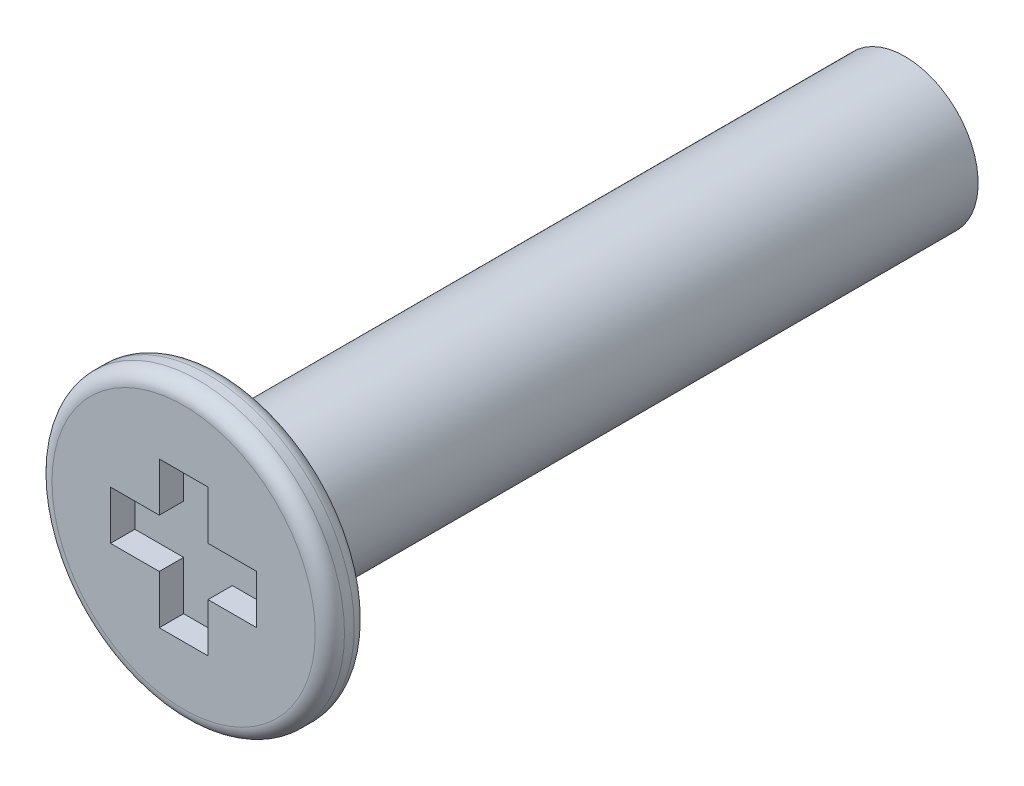
ISO-10303-21;
HEADER;
FILE_DESCRIPTION(('STEP AP214'),'2;1');
FILE_NAME('part.step','',(''),(''),'','','');
FILE_SCHEMA(('AUTOMOTIVE_DESIGN { 1 0 10303 214 1 1 1 1 }'));
ENDSEC;
DATA;
#1=APPLICATION_CONTEXT('core data for automotive mechanical design processes');
#2=APPLICATION_PROTOCOL_DEFINITION('international standard','automotive_design',2000,#1);
#3=PRODUCT_CONTEXT('',#1,'mechanical');
#4=PRODUCT('Part','Part','',(#3));
#5=PRODUCT_RELATED_PRODUCT_CATEGORY('part','',(#4));
#6=PRODUCT_DEFINITION_FORMATION('','',#4);
#7=PRODUCT_DEFINITION_CONTEXT('part definition',#1,'design');
#8=PRODUCT_DEFINITION('design','',#6,#7);
#9=PRODUCT_DEFINITION_SHAPE('','',#8);
#10=(LENGTH_UNIT() NAMED_UNIT(*) SI_UNIT(.MILLI.,.METRE.));
#11=(NAMED_UNIT(*) PLANE_ANGLE_UNIT() SI_UNIT($,.RADIAN.));
#12=(NAMED_UNIT(*) SI_UNIT($,.STERADIAN.) SOLID_ANGLE_UNIT());
#13=UNCERTAINTY_MEASURE_WITH_UNIT(LENGTH_MEASURE(1.E-05),#10,'distance_accuracy_value','');
#14=(GEOMETRIC_REPRESENTATION_CONTEXT(3) GLOBAL_UNCERTAINTY_ASSIGNED_CONTEXT((#13)) GLOBAL_UNIT_ASSIGNED_CONTEXT((#10,
#11,#12)) REPRESENTATION_CONTEXT('',''));
#15=CARTESIAN_POINT('',(0.,0.,0.));
#16=DIRECTION('',(0.,0.,1.));
#17=DIRECTION('',(1.,0.,0.));
#18=AXIS2_PLACEMENT_3D('',#15,#16,#17);
#19=CARTESIAN_POINT('',(0.,0.,0.3));
#20=DIRECTION('',(0.,0.,-1.));
#21=DIRECTION('',(0.,-1.,0.));
#22=AXIS2_PLACEMENT_3D('',#19,#20,#21);
#23=PLANE('',#22);
#24=DIRECTION('',(-1.,0.,0.));
#25=VECTOR('',#24,1.);
#26=CARTESIAN_POINT('',(0.499999988824129,-1.49999996647239,0.3));
#27=LINE('',#26,#25);
#28=CARTESIAN_POINT('',(0.499999988824129,-1.49999996647239,0.3));
#29=VERTEX_POINT('',#28);
#30=CARTESIAN_POINT('',(-0.499999988824129,-1.49999996647239,0.3));
#31=VERTEX_POINT('',#30);
#32=EDGE_CURVE('E11',#29,#31,#27,.T.);
#33=ORIENTED_EDGE('',*,*,#32,.F.);
#34=DIRECTION('',(0.,-1.,0.));
#35=VECTOR('',#34,1.);
#36=CARTESIAN_POINT('',(0.499999988824129,1.49999996647239,0.3));
#37=LINE('',#36,#35);
#38=CARTESIAN_POINT('',(0.499999988824129,-0.499999988824129,0.3));
#39=VERTEX_POINT('',#38);
#40=EDGE_CURVE('E281',#39,#29,#37,.T.);
#41=ORIENTED_EDGE('',*,*,#40,.F.);
#42=DIRECTION('',(-1.,0.,0.));
#43=VECTOR('',#42,1.);
#44=CARTESIAN_POINT('',(1.49999996647239,-0.499999988824129,0.3));
#45=LINE('',#44,#43);
#46=CARTESIAN_POINT('',(1.49999996647239,-0.499999988824129,0.3));
#47=VERTEX_POINT('',#46);
#48=EDGE_CURVE('E227',#47,#39,#45,.T.);
#49=ORIENTED_EDGE('',*,*,#48,.F.);
#50=DIRECTION('',(0.,-1.,0.));
#51=VECTOR('',#50,1.);
#52=CARTESIAN_POINT('',(1.49999996647239,0.499999988824129,0.3));
#53=LINE('',#52,#51);
#54=CARTESIAN_POINT('',(1.49999996647239,0.499999988824129,0.3));
#55=VERTEX_POINT('',#54);
#56=EDGE_CURVE('E292',#55,#47,#53,.T.);
#57=ORIENTED_EDGE('',*,*,#56,.F.);
#58=DIRECTION('',(1.,0.,0.));
#59=VECTOR('',#58,1.);
#60=CARTESIAN_POINT('',(-1.49999996647239,0.499999988824129,0.3));
#61=LINE('',#60,#59);
#62=CARTESIAN_POINT('',(0.499999988824129,0.499999988824129,0.3));
#63=VERTEX_POINT('',#62);
#64=EDGE_CURVE('E291',#63,#55,#61,.T.);
#65=ORIENTED_EDGE('',*,*,#64,.F.);
#66=DIRECTION('',(0.,-1.,0.));
#67=VECTOR('',#66,1.);
#68=CARTESIAN_POINT('',(0.499999988824129,1.49999996647239,0.3));
#69=LINE('',#68,#67);
#70=CARTESIAN_POINT('',(0.499999988824129,1.49999996647239,0.3));
#71=VERTEX_POINT('',#70);
#72=EDGE_CURVE('E187',#71,#63,#69,.T.);
#73=ORIENTED_EDGE('',*,*,#72,.F.);
#74=DIRECTION('',(1.,0.,0.));
#75=VECTOR('',#74,1.);
#76=CARTESIAN_POINT('',(-0.499999988824129,1.49999996647239,0.3));
#77=LINE('',#76,#75);
#78=CARTESIAN_POINT('',(-0.499999988824129,1.49999996647239,0.3));
#79=VERTEX_POINT('',#78);
#80=EDGE_CURVE('E186',#79,#71,#77,.T.);
#81=ORIENTED_EDGE('',*,*,#80,.F.);
#82=DIRECTION('',(0.,1.,0.));
#83=VECTOR('',#82,1.);
#84=CARTESIAN_POINT('',(-0.499999988824129,-1.49999996647239,0.3));
#85=LINE('',#84,#83);
#86=CARTESIAN_POINT('',(-0.499999988824129,0.499999988824129,0.3));
#87=VERTEX_POINT('',#86);
#88=EDGE_CURVE('E191',#87,#79,#85,.T.);
#89=ORIENTED_EDGE('',*,*,#88,.F.);
#90=DIRECTION('',(1.,0.,0.));
#91=VECTOR('',#90,1.);
#92=CARTESIAN_POINT('',(-1.49999996647239,0.499999988824129,0.3));
#93=LINE('',#92,#91);
#94=CARTESIAN_POINT('',(-1.49999996647239,0.499999988824129,0.3));
#95=VERTEX_POINT('',#94);
#96=EDGE_CURVE('E257',#95,#87,#93,.T.);
#97=ORIENTED_EDGE('',*,*,#96,.F.);
#98=DIRECTION('',(0.,1.,0.));
#99=VECTOR('',#98,1.);
#100=CARTESIAN_POINT('',(-1.49999996647239,-0.499999988824129,0.3));
#101=LINE('',#100,#99);
#102=CARTESIAN_POINT('',(-1.49999996647239,-0.499999988824129,0.3));
#103=VERTEX_POINT('',#102);
#104=EDGE_CURVE('E315',#103,#95,#101,.T.);
#105=ORIENTED_EDGE('',*,*,#104,.F.);
#106=DIRECTION('',(-1.,0.,0.));
#107=VECTOR('',#106,1.);
#108=CARTESIAN_POINT('',(1.49999996647239,-0.499999988824129,0.3));
#109=LINE('',#108,#107);
#110=CARTESIAN_POINT('',(-0.499999988824129,-0.499999988824129,0.3));
#111=VERTEX_POINT('',#110);
#112=EDGE_CURVE('E322',#111,#103,#109,.T.);
#113=ORIENTED_EDGE('',*,*,#112,.F.);
#114=DIRECTION('',(0.,1.,0.));
#115=VECTOR('',#114,1.);
#116=CARTESIAN_POINT('',(-0.499999988824129,-1.49999996647239,0.3));
#117=LINE('',#116,#115);
#118=EDGE_CURVE('E25',#31,#111,#117,.T.);
#119=ORIENTED_EDGE('',*,*,#118,.F.);
#120=EDGE_LOOP('',(#33,#41,#49,#57,#65,#73,#81,#89,#97,#105,#113,#119));
#121=FACE_BOUND('',#120,.T.);
#122=ADVANCED_FACE('F17',(#121),#23,.F.);
#123=CARTESIAN_POINT('',(0.499999988824129,-1.49999996647239,0.8));
#124=DIRECTION('',(0.,-1.,0.));
#125=DIRECTION('',(0.,0.,-1.));
#126=AXIS2_PLACEMENT_3D('',#123,#124,#125);
#127=PLANE('',#126);
#128=DIRECTION('',(-1.,0.,0.));
#129=VECTOR('',#128,1.);
#130=CARTESIAN_POINT('',(0.249999994412065,-1.49999996647239,0.8));
#131=LINE('',#130,#129);
#132=CARTESIAN_POINT('',(0.499999988824129,-1.49999996647239,0.8));
#133=VERTEX_POINT('',#132);
#134=CARTESIAN_POINT('',(-0.499999988824129,-1.49999996647239,0.8));
#135=VERTEX_POINT('',#134);
#136=EDGE_CURVE('E201',#133,#135,#131,.T.);
#137=ORIENTED_EDGE('',*,*,#136,.F.);
#138=DIRECTION('',(0.,0.,-1.));
#139=VECTOR('',#138,1.);
#140=CARTESIAN_POINT('',(0.499999988824129,-1.49999996647239,0.8));
#141=LINE('',#140,#139);
#142=EDGE_CURVE('E228',#133,#29,#141,.T.);
#143=ORIENTED_EDGE('',*,*,#142,.T.);
#144=ORIENTED_EDGE('',*,*,#32,.T.);
#145=DIRECTION('',(0.,0.,-1.));
#146=VECTOR('',#145,1.);
#147=CARTESIAN_POINT('',(-0.499999988824129,-1.49999996647239,0.8));
#148=LINE('',#147,#146);
#149=EDGE_CURVE('E181',#135,#31,#148,.T.);
#150=ORIENTED_EDGE('',*,*,#149,.F.);
#151=EDGE_LOOP('',(#137,#143,#144,#150));
#152=FACE_BOUND('',#151,.T.);
#153=ADVANCED_FACE('F330',(#152),#127,.F.);
#154=CARTESIAN_POINT('',(-0.499999988824129,-1.49999996647239,0.8));
#155=DIRECTION('',(-1.,0.,0.));
#156=DIRECTION('',(0.,0.,1.));
#157=AXIS2_PLACEMENT_3D('',#154,#155,#156);
#158=PLANE('',#157);
#159=DIRECTION('',(0.,1.,0.));
#160=VECTOR('',#159,1.);
#161=CARTESIAN_POINT('',(-0.499999988824129,-0.749999983236194,0.8));
#162=LINE('',#161,#160);
#163=CARTESIAN_POINT('',(-0.499999988824129,-0.499999988824129,0.8));
#164=VERTEX_POINT('',#163);
#165=EDGE_CURVE('E196',#135,#164,#162,.T.);
#166=ORIENTED_EDGE('',*,*,#165,.F.);
#167=ORIENTED_EDGE('',*,*,#149,.T.);
#168=ORIENTED_EDGE('',*,*,#118,.T.);
#169=DIRECTION('',(0.,0.,-1.));
#170=VECTOR('',#169,1.);
#171=CARTESIAN_POINT('',(-0.499999988824129,-0.499999988824129,0.8));
#172=LINE('',#171,#170);
#173=EDGE_CURVE('E318',#164,#111,#172,.T.);
#174=ORIENTED_EDGE('',*,*,#173,.F.);
#175=EDGE_LOOP('',(#166,#167,#168,#174));
#176=FACE_BOUND('',#175,.T.);
#177=ADVANCED_FACE('F328',(#176),#158,.F.);
#178=CARTESIAN_POINT('',(-0.499999988824129,-0.499999988824129,0.8));
#179=DIRECTION('',(0.,-1.,0.));
#180=DIRECTION('',(0.,0.,-1.));
#181=AXIS2_PLACEMENT_3D('',#178,#179,#180);
#182=PLANE('',#181);
#183=DIRECTION('',(-1.,0.,0.));
#184=VECTOR('',#183,1.);
#185=CARTESIAN_POINT('',(-0.249999994412065,-0.499999988824129,0.8));
#186=LINE('',#185,#184);
#187=CARTESIAN_POINT('',(-1.49999996647239,-0.499999988824129,0.8));
#188=VERTEX_POINT('',#187);
#189=EDGE_CURVE('E200',#164,#188,#186,.T.);
#190=ORIENTED_EDGE('',*,*,#189,.F.);
#191=ORIENTED_EDGE('',*,*,#173,.T.);
#192=ORIENTED_EDGE('',*,*,#112,.T.);
#193=DIRECTION('',(0.,0.,-1.));
#194=VECTOR('',#193,1.);
#195=CARTESIAN_POINT('',(-1.49999996647239,-0.499999988824129,0.8));
#196=LINE('',#195,#194);
#197=EDGE_CURVE('E311',#188,#103,#196,.T.);
#198=ORIENTED_EDGE('',*,*,#197,.F.);
#199=EDGE_LOOP('',(#190,#191,#192,#198));
#200=FACE_BOUND('',#199,.T.);
#201=ADVANCED_FACE('F346',(#200),#182,.F.);
#202=CARTESIAN_POINT('',(-1.49999996647239,-0.499999988824129,0.8));
#203=DIRECTION('',(-1.,0.,0.));
#204=DIRECTION('',(0.,0.,1.));
#205=AXIS2_PLACEMENT_3D('',#202,#203,#204);
#206=PLANE('',#205);
#207=DIRECTION('',(0.,1.,0.));
#208=VECTOR('',#207,1.);
#209=CARTESIAN_POINT('',(-1.49999996647239,-0.249999994412065,0.8));
#210=LINE('',#209,#208);
#211=CARTESIAN_POINT('',(-1.49999996647239,0.499999988824129,0.8));
#212=VERTEX_POINT('',#211);
#213=EDGE_CURVE('E178',#188,#212,#210,.T.);
#214=ORIENTED_EDGE('',*,*,#213,.F.);
#215=ORIENTED_EDGE('',*,*,#197,.T.);
#216=ORIENTED_EDGE('',*,*,#104,.T.);
#217=DIRECTION('',(0.,0.,-1.));
#218=VECTOR('',#217,1.);
#219=CARTESIAN_POINT('',(-1.49999996647239,0.499999988824129,0.8));
#220=LINE('',#219,#218);
#221=EDGE_CURVE('E194',#212,#95,#220,.T.);
#222=ORIENTED_EDGE('',*,*,#221,.F.);
#223=EDGE_LOOP('',(#214,#215,#216,#222));
#224=FACE_BOUND('',#223,.T.);
#225=ADVANCED_FACE('F350',(#224),#206,.F.);
#226=CARTESIAN_POINT('',(-1.49999996647239,0.499999988824129,0.8));
#227=DIRECTION('',(0.,1.,0.));
#228=DIRECTION('',(1.,0.,0.));
#229=AXIS2_PLACEMENT_3D('',#226,#227,#228);
#230=PLANE('',#229);
#231=DIRECTION('',(1.,0.,0.));
#232=VECTOR('',#231,1.);
#233=CARTESIAN_POINT('',(-0.749999983236194,0.499999988824129,0.8));
#234=LINE('',#233,#232);
#235=CARTESIAN_POINT('',(-0.499999988824129,0.499999988824129,0.8));
#236=VERTEX_POINT('',#235);
#237=EDGE_CURVE('E173',#212,#236,#234,.T.);
#238=ORIENTED_EDGE('',*,*,#237,.F.);
#239=ORIENTED_EDGE('',*,*,#221,.T.);
#240=ORIENTED_EDGE('',*,*,#96,.T.);
#241=DIRECTION('',(0.,0.,-1.));
#242=VECTOR('',#241,1.);
#243=CARTESIAN_POINT('',(-0.499999988824129,0.499999988824129,0.8));
#244=LINE('',#243,#242);
#245=EDGE_CURVE('E195',#236,#87,#244,.T.);
#246=ORIENTED_EDGE('',*,*,#245,.F.);
#247=EDGE_LOOP('',(#238,#239,#240,#246));
#248=FACE_BOUND('',#247,.T.);
#249=ADVANCED_FACE('F352',(#248),#230,.F.);
#250=CARTESIAN_POINT('',(-0.499999988824129,0.499999988824129,0.8));
#251=DIRECTION('',(-1.,0.,0.));
#252=DIRECTION('',(0.,0.,1.));
#253=AXIS2_PLACEMENT_3D('',#250,#251,#252);
#254=PLANE('',#253);
#255=DIRECTION('',(0.,1.,0.));
#256=VECTOR('',#255,1.);
#257=CARTESIAN_POINT('',(-0.499999988824129,0.249999994412065,0.8));
#258=LINE('',#257,#256);
#259=CARTESIAN_POINT('',(-0.499999988824129,1.49999996647239,0.8));
#260=VERTEX_POINT('',#259);
#261=EDGE_CURVE('E177',#236,#260,#258,.T.);
#262=ORIENTED_EDGE('',*,*,#261,.F.);
#263=ORIENTED_EDGE('',*,*,#245,.T.);
#264=ORIENTED_EDGE('',*,*,#88,.T.);
#265=DIRECTION('',(0.,0.,-1.));
#266=VECTOR('',#265,1.);
#267=CARTESIAN_POINT('',(-0.499999988824129,1.49999996647239,0.8));
#268=LINE('',#267,#266);
#269=EDGE_CURVE('E182',#260,#79,#268,.T.);
#270=ORIENTED_EDGE('',*,*,#269,.F.);
#271=EDGE_LOOP('',(#262,#263,#264,#270));
#272=FACE_BOUND('',#271,.T.);
#273=ADVANCED_FACE('F356',(#272),#254,.F.);
#274=CARTESIAN_POINT('',(-0.499999988824129,1.49999996647239,0.8));
#275=DIRECTION('',(0.,1.,0.));
#276=DIRECTION('',(1.,0.,0.));
#277=AXIS2_PLACEMENT_3D('',#274,#275,#276);
#278=PLANE('',#277);
#279=DIRECTION('',(1.,0.,0.));
#280=VECTOR('',#279,1.);
#281=CARTESIAN_POINT('',(-0.249999994412065,1.49999996647239,0.8));
#282=LINE('',#281,#280);
#283=CARTESIAN_POINT('',(0.499999988824129,1.49999996647239,0.8));
#284=VERTEX_POINT('',#283);
#285=EDGE_CURVE('E261',#260,#284,#282,.T.);
#286=ORIENTED_EDGE('',*,*,#285,.F.);
#287=ORIENTED_EDGE('',*,*,#269,.T.);
#288=ORIENTED_EDGE('',*,*,#80,.T.);
#289=DIRECTION('',(0.,0.,-1.));
#290=VECTOR('',#289,1.);
#291=CARTESIAN_POINT('',(0.499999988824129,1.49999996647239,0.8));
#292=LINE('',#291,#290);
#293=EDGE_CURVE('E303',#284,#71,#292,.T.);
#294=ORIENTED_EDGE('',*,*,#293,.F.);
#295=EDGE_LOOP('',(#286,#287,#288,#294));
#296=FACE_BOUND('',#295,.T.);
#297=ADVANCED_FACE('F360',(#296),#278,.F.);
#298=CARTESIAN_POINT('',(0.499999988824129,1.49999996647239,0.8));
#299=DIRECTION('',(1.,0.,0.));
#300=DIRECTION('',(0.,1.,0.));
#301=AXIS2_PLACEMENT_3D('',#298,#299,#300);
#302=PLANE('',#301);
#303=DIRECTION('',(0.,-1.,0.));
#304=VECTOR('',#303,1.);
#305=CARTESIAN_POINT('',(0.499999988824129,0.749999983236194,0.8));
#306=LINE('',#305,#304);
#307=CARTESIAN_POINT('',(0.499999988824129,0.499999988824129,0.8));
#308=VERTEX_POINT('',#307);
#309=EDGE_CURVE('E265',#284,#308,#306,.T.);
#310=ORIENTED_EDGE('',*,*,#309,.F.);
#311=ORIENTED_EDGE('',*,*,#293,.T.);
#312=ORIENTED_EDGE('',*,*,#72,.T.);
#313=DIRECTION('',(0.,0.,-1.));
#314=VECTOR('',#313,1.);
#315=CARTESIAN_POINT('',(0.499999988824129,0.499999988824129,0.8));
#316=LINE('',#315,#314);
#317=EDGE_CURVE('E287',#308,#63,#316,.T.);
#318=ORIENTED_EDGE('',*,*,#317,.F.);
#319=EDGE_LOOP('',(#310,#311,#312,#318));
#320=FACE_BOUND('',#319,.T.);
#321=ADVANCED_FACE('F364',(#320),#302,.F.);
#322=CARTESIAN_POINT('',(0.499999988824129,0.499999988824129,0.8));
#323=DIRECTION('',(0.,1.,0.));
#324=DIRECTION('',(1.,0.,0.));
#325=AXIS2_PLACEMENT_3D('',#322,#323,#324);
#326=PLANE('',#325);
#327=DIRECTION('',(1.,0.,0.));
#328=VECTOR('',#327,1.);
#329=CARTESIAN_POINT('',(0.249999994412065,0.499999988824129,0.8));
#330=LINE('',#329,#328);
#331=CARTESIAN_POINT('',(1.49999996647239,0.499999988824129,0.8));
#332=VERTEX_POINT('',#331);
#333=EDGE_CURVE('E269',#308,#332,#330,.T.);
#334=ORIENTED_EDGE('',*,*,#333,.F.);
#335=ORIENTED_EDGE('',*,*,#317,.T.);
#336=ORIENTED_EDGE('',*,*,#64,.T.);
#337=DIRECTION('',(0.,0.,-1.));
#338=VECTOR('',#337,1.);
#339=CARTESIAN_POINT('',(1.49999996647239,0.499999988824129,0.8));
#340=LINE('',#339,#338);
#341=EDGE_CURVE('E295',#332,#55,#340,.T.);
#342=ORIENTED_EDGE('',*,*,#341,.F.);
#343=EDGE_LOOP('',(#334,#335,#336,#342));
#344=FACE_BOUND('',#343,.T.);
#345=ADVANCED_FACE('F368',(#344),#326,.F.);
#346=CARTESIAN_POINT('',(1.49999996647239,0.499999988824129,0.8));
#347=DIRECTION('',(1.,0.,0.));
#348=DIRECTION('',(0.,1.,0.));
#349=AXIS2_PLACEMENT_3D('',#346,#347,#348);
#350=PLANE('',#349);
#351=DIRECTION('',(0.,-1.,0.));
#352=VECTOR('',#351,1.);
#353=CARTESIAN_POINT('',(1.49999996647239,0.249999994412065,0.8));
#354=LINE('',#353,#352);
#355=CARTESIAN_POINT('',(1.49999996647239,-0.499999988824129,0.8));
#356=VERTEX_POINT('',#355);
#357=EDGE_CURVE('E218',#332,#356,#354,.T.);
#358=ORIENTED_EDGE('',*,*,#357,.F.);
#359=ORIENTED_EDGE('',*,*,#341,.T.);
#360=ORIENTED_EDGE('',*,*,#56,.T.);
#361=DIRECTION('',(0.,0.,-1.));
#362=VECTOR('',#361,1.);
#363=CARTESIAN_POINT('',(1.49999996647239,-0.499999988824129,0.8));
#364=LINE('',#363,#362);
#365=EDGE_CURVE('E223',#356,#47,#364,.T.);
#366=ORIENTED_EDGE('',*,*,#365,.F.);
#367=EDGE_LOOP('',(#358,#359,#360,#366));
#368=FACE_BOUND('',#367,.T.);
#369=ADVANCED_FACE('F371',(#368),#350,.F.);
#370=CARTESIAN_POINT('',(1.49999996647239,-0.499999988824129,0.8));
#371=DIRECTION('',(0.,-1.,0.));
#372=DIRECTION('',(0.,0.,-1.));
#373=AXIS2_PLACEMENT_3D('',#370,#371,#372);
#374=PLANE('',#373);
#375=DIRECTION('',(-1.,0.,0.));
#376=VECTOR('',#375,1.);
#377=CARTESIAN_POINT('',(0.749999983236194,-0.499999988824129,0.8));
#378=LINE('',#377,#376);
#379=CARTESIAN_POINT('',(0.499999988824129,-0.499999988824129,0.8));
#380=VERTEX_POINT('',#379);
#381=EDGE_CURVE('E213',#356,#380,#378,.T.);
#382=ORIENTED_EDGE('',*,*,#381,.F.);
#383=ORIENTED_EDGE('',*,*,#365,.T.);
#384=ORIENTED_EDGE('',*,*,#48,.T.);
#385=DIRECTION('',(0.,0.,-1.));
#386=VECTOR('',#385,1.);
#387=CARTESIAN_POINT('',(0.499999988824129,-0.499999988824129,0.8));
#388=LINE('',#387,#386);
#389=EDGE_CURVE('E217',#380,#39,#388,.T.);
#390=ORIENTED_EDGE('',*,*,#389,.F.);
#391=EDGE_LOOP('',(#382,#383,#384,#390));
#392=FACE_BOUND('',#391,.T.);
#393=ADVANCED_FACE('F373',(#392),#374,.F.);
#394=CARTESIAN_POINT('',(0.499999988824129,-0.499999988824129,0.8));
#395=DIRECTION('',(1.,0.,0.));
#396=DIRECTION('',(0.,1.,0.));
#397=AXIS2_PLACEMENT_3D('',#394,#395,#396);
#398=PLANE('',#397);
#399=DIRECTION('',(0.,-1.,0.));
#400=VECTOR('',#399,1.);
#401=CARTESIAN_POINT('',(0.499999988824129,-0.249999994412065,0.8));
#402=LINE('',#401,#400);
#403=EDGE_CURVE('E241',#380,#133,#402,.T.);
#404=ORIENTED_EDGE('',*,*,#403,.F.);
#405=ORIENTED_EDGE('',*,*,#389,.T.);
#406=ORIENTED_EDGE('',*,*,#40,.T.);
#407=ORIENTED_EDGE('',*,*,#142,.F.);
#408=EDGE_LOOP('',(#404,#405,#406,#407));
#409=FACE_BOUND('',#408,.T.);
#410=ADVANCED_FACE('F337',(#409),#398,.F.);
#411=CARTESIAN_POINT('',(0.,0.,0.8));
#412=DIRECTION('',(0.,0.,1.));
#413=DIRECTION('',(1.,0.,0.));
#414=AXIS2_PLACEMENT_3D('',#411,#412,#413);
#415=PLANE('',#414);
#416=ORIENTED_EDGE('',*,*,#403,.T.);
#417=ORIENTED_EDGE('',*,*,#136,.T.);
#418=ORIENTED_EDGE('',*,*,#165,.T.);
#419=ORIENTED_EDGE('',*,*,#189,.T.);
#420=ORIENTED_EDGE('',*,*,#213,.T.);
#421=ORIENTED_EDGE('',*,*,#237,.T.);
#422=ORIENTED_EDGE('',*,*,#261,.T.);
#423=ORIENTED_EDGE('',*,*,#285,.T.);
#424=ORIENTED_EDGE('',*,*,#309,.T.);
#425=ORIENTED_EDGE('',*,*,#333,.T.);
#426=ORIENTED_EDGE('',*,*,#357,.T.);
#427=ORIENTED_EDGE('',*,*,#381,.T.);
#428=EDGE_LOOP('',(#416,#417,#418,#419,#420,#421,#422,#423,#424,#425,#426,#427));
#429=FACE_BOUND('',#428,.T.);
#430=CARTESIAN_POINT('',(0.,0.,0.8));
#431=DIRECTION('',(0.,0.,-1.));
#432=DIRECTION('',(1.,0.,0.));
#433=AXIS2_PLACEMENT_3D('',#430,#431,#432);
#434=CIRCLE('',#433,2.7);
#435=CARTESIAN_POINT('',(-2.7,0.,0.8));
#436=VERTEX_POINT('',#435);
#437=EDGE_CURVE('E229',#436,#436,#434,.T.);
#438=ORIENTED_EDGE('',*,*,#437,.F.);
#439=EDGE_LOOP('',(#438));
#440=FACE_BOUND('',#439,.T.);
#441=ADVANCED_FACE('F333',(#429,#440),#415,.T.);
#442=CARTESIAN_POINT('',(0.,0.,0.5));
#443=DIRECTION('',(0.,0.,1.));
#444=DIRECTION('',(1.,0.,0.));
#445=AXIS2_PLACEMENT_3D('',#442,#443,#444);
#446=TOROIDAL_SURFACE('',#445,2.7,0.3);
#447=ORIENTED_EDGE('',*,*,#437,.T.);
#448=CARTESIAN_POINT('',(-2.7,0.,0.5));
#449=DIRECTION('',(0.,-1.,0.));
#450=DIRECTION('',(-1.,0.,0.));
#451=AXIS2_PLACEMENT_3D('',#448,#449,#450);
#452=CIRCLE('',#451,0.3);
#453=CARTESIAN_POINT('',(-3.,0.,0.5));
#454=VERTEX_POINT('',#453);
#455=EDGE_CURVE('E233',#436,#454,#452,.T.);
#456=ORIENTED_EDGE('',*,*,#455,.T.);
#457=CARTESIAN_POINT('',(0.,0.,0.5));
#458=DIRECTION('',(0.,0.,1.));
#459=DIRECTION('',(1.,0.,0.));
#460=AXIS2_PLACEMENT_3D('',#457,#458,#459);
#461=CIRCLE('',#460,3.);
#462=EDGE_CURVE('E212',#454,#454,#461,.T.);
#463=ORIENTED_EDGE('',*,*,#462,.T.);
#464=ORIENTED_EDGE('',*,*,#455,.F.);
#465=EDGE_LOOP('',(#447,#456,#463,#464));
#466=FACE_BOUND('',#465,.T.);
#467=ADVANCED_FACE('F408',(#466),#446,.T.);
#468=CARTESIAN_POINT('',(0.,0.,0.));
#469=DIRECTION('',(0.,0.,1.));
#470=DIRECTION('',(1.,0.,0.));
#471=AXIS2_PLACEMENT_3D('',#468,#469,#470);
#472=PLANE('',#471);
#473=CARTESIAN_POINT('',(0.,0.,0.));
#474=DIRECTION('',(0.,0.,1.));
#475=DIRECTION('',(1.,0.,0.));
#476=AXIS2_PLACEMENT_3D('',#473,#474,#475);
#477=CIRCLE('',#476,1.5);
#478=CARTESIAN_POINT('',(-1.5,0.,0.));
#479=VERTEX_POINT('',#478);
#480=EDGE_CURVE('E162',#479,#479,#477,.T.);
#481=ORIENTED_EDGE('',*,*,#480,.T.);
#482=EDGE_LOOP('',(#481));
#483=FACE_BOUND('',#482,.T.);
#484=CARTESIAN_POINT('',(0.,0.,0.));
#485=DIRECTION('',(0.,0.,1.));
#486=DIRECTION('',(1.,0.,0.));
#487=AXIS2_PLACEMENT_3D('',#484,#485,#486);
#488=CIRCLE('',#487,2.7);
#489=CARTESIAN_POINT('',(-2.7,0.,0.));
#490=VERTEX_POINT('',#489);
#491=EDGE_CURVE('E209',#490,#490,#488,.T.);
#492=ORIENTED_EDGE('',*,*,#491,.F.);
#493=EDGE_LOOP('',(#492));
#494=FACE_BOUND('',#493,.T.);
#495=ADVANCED_FACE('F411',(#483,#494),#472,.F.);
#496=CARTESIAN_POINT('',(0.,0.,0.));
#497=DIRECTION('',(0.,0.,1.));
#498=DIRECTION('',(1.,0.,0.));
#499=AXIS2_PLACEMENT_3D('',#496,#497,#498);
#500=CYLINDRICAL_SURFACE('',#499,3.);
#501=ORIENTED_EDGE('',*,*,#462,.F.);
#502=DIRECTION('',(0.,0.,-1.));
#503=VECTOR('',#502,1.);
#504=CARTESIAN_POINT('',(-3.,0.,0.));
#505=LINE('',#504,#503);
#506=CARTESIAN_POINT('',(-3.,0.,0.3));
#507=VERTEX_POINT('',#506);
#508=EDGE_CURVE('E222',#454,#507,#505,.T.);
#509=ORIENTED_EDGE('',*,*,#508,.T.);
#510=CARTESIAN_POINT('',(0.,0.,0.3));
#511=DIRECTION('',(0.,0.,-1.));
#512=DIRECTION('',(1.,0.,0.));
#513=AXIS2_PLACEMENT_3D('',#510,#511,#512);
#514=CIRCLE('',#513,3.);
#515=EDGE_CURVE('E190',#507,#507,#514,.T.);
#516=ORIENTED_EDGE('',*,*,#515,.F.);
#517=ORIENTED_EDGE('',*,*,#508,.F.);
#518=EDGE_LOOP('',(#501,#509,#516,#517));
#519=FACE_BOUND('',#518,.T.);
#520=ADVANCED_FACE('F414',(#519),#500,.T.);
#521=CARTESIAN_POINT('',(0.,0.,0.3));
#522=DIRECTION('',(0.,0.,1.));
#523=DIRECTION('',(1.,0.,0.));
#524=AXIS2_PLACEMENT_3D('',#521,#522,#523);
#525=TOROIDAL_SURFACE('',#524,2.7,0.3);
#526=ORIENTED_EDGE('',*,*,#515,.T.);
#527=CARTESIAN_POINT('',(-2.7,0.,0.3));
#528=DIRECTION('',(0.,-1.,0.));
#529=DIRECTION('',(-1.,0.,0.));
#530=AXIS2_PLACEMENT_3D('',#527,#528,#529);
#531=CIRCLE('',#530,0.3);
#532=EDGE_CURVE('E205',#507,#490,#531,.T.);
#533=ORIENTED_EDGE('',*,*,#532,.T.);
#534=ORIENTED_EDGE('',*,*,#491,.T.);
#535=ORIENTED_EDGE('',*,*,#532,.F.);
#536=EDGE_LOOP('',(#526,#533,#534,#535));
#537=FACE_BOUND('',#536,.T.);
#538=ADVANCED_FACE('F420',(#537),#525,.T.);
#539=CARTESIAN_POINT('',(0.,0.,0.));
#540=DIRECTION('',(0.,0.,-1.));
#541=DIRECTION('',(1.,0.,0.));
#542=AXIS2_PLACEMENT_3D('',#539,#540,#541);
#543=CYLINDRICAL_SURFACE('',#542,1.5);
#544=CARTESIAN_POINT('',(0.,0.,-14.));
#545=DIRECTION('',(0.,0.,-1.));
#546=DIRECTION('',(1.,0.,0.));
#547=AXIS2_PLACEMENT_3D('',#544,#545,#546);
#548=CIRCLE('',#547,1.5);
#549=CARTESIAN_POINT('',(-1.5,0.,-14.));
#550=VERTEX_POINT('',#549);
#551=EDGE_CURVE('E161',#550,#550,#548,.T.);
#552=ORIENTED_EDGE('',*,*,#551,.F.);
#553=DIRECTION('',(0.,0.,1.));
#554=VECTOR('',#553,1.);
#555=CARTESIAN_POINT('',(-1.5,0.,0.));
#556=LINE('',#555,#554);
#557=EDGE_CURVE('E158',#550,#479,#556,.T.);
#558=ORIENTED_EDGE('',*,*,#557,.T.);
#559=ORIENTED_EDGE('',*,*,#480,.F.);
#560=ORIENTED_EDGE('',*,*,#557,.F.);
#561=EDGE_LOOP('',(#552,#558,#559,#560));
#562=FACE_BOUND('',#561,.T.);
#563=ADVANCED_FACE('F160',(#562),#543,.T.);
#564=CARTESIAN_POINT('',(0.,0.,-14.));
#565=DIRECTION('',(0.,0.,-1.));
#566=DIRECTION('',(0.,-1.,0.));
#567=AXIS2_PLACEMENT_3D('',#564,#565,#566);
#568=PLANE('',#567);
#569=ORIENTED_EDGE('',*,*,#551,.T.);
#570=EDGE_LOOP('',(#569));
#571=FACE_BOUND('',#570,.T.);
#572=ADVANCED_FACE('F166',(#571),#568,.T.);
#573=CLOSED_SHELL('',(#122,#153,#177,#201,#225,#249,#273,#297,#321,#345,#369,#393,#410,#441,
#467,#495,#520,#538,#563,#572));
#574=MANIFOLD_SOLID_BREP('B1',#573);
#575=ADVANCED_BREP_SHAPE_REPRESENTATION('',(#18,#574),#14);
#576=SHAPE_DEFINITION_REPRESENTATION(#9,#575);
ENDSEC;
END-ISO-10303-21;
